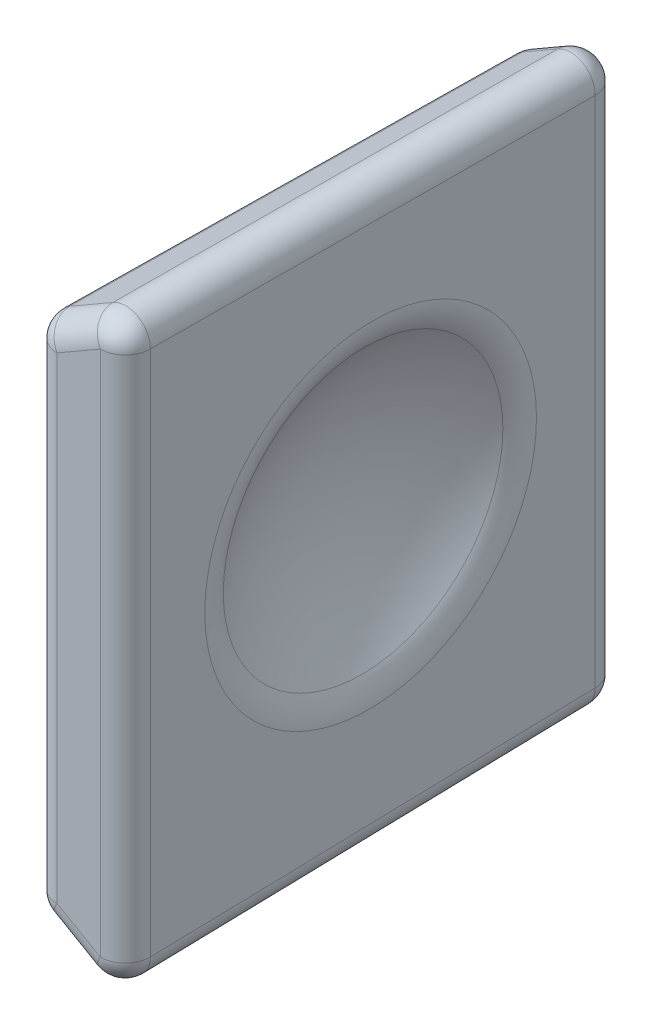
ISO-10303-21;
HEADER;
FILE_DESCRIPTION(('STEP AP214'),'2;1');
FILE_NAME('part.step','',(''),(''),'','','');
FILE_SCHEMA(('AUTOMOTIVE_DESIGN { 1 0 10303 214 1 1 1 1 }'));
ENDSEC;
DATA;
#1=APPLICATION_CONTEXT('core data for automotive mechanical design processes');
#2=APPLICATION_PROTOCOL_DEFINITION('international standard','automotive_design',2000,#1);
#3=PRODUCT_CONTEXT('',#1,'mechanical');
#4=PRODUCT('Part','Part','',(#3));
#5=PRODUCT_RELATED_PRODUCT_CATEGORY('part','',(#4));
#6=PRODUCT_DEFINITION_FORMATION('','',#4);
#7=PRODUCT_DEFINITION_CONTEXT('part definition',#1,'design');
#8=PRODUCT_DEFINITION('design','',#6,#7);
#9=PRODUCT_DEFINITION_SHAPE('','',#8);
#10=(LENGTH_UNIT() NAMED_UNIT(*) SI_UNIT(.MILLI.,.METRE.));
#11=(NAMED_UNIT(*) PLANE_ANGLE_UNIT() SI_UNIT($,.RADIAN.));
#12=(NAMED_UNIT(*) SI_UNIT($,.STERADIAN.) SOLID_ANGLE_UNIT());
#13=UNCERTAINTY_MEASURE_WITH_UNIT(LENGTH_MEASURE(1.E-05),#10,'distance_accuracy_value','');
#14=(GEOMETRIC_REPRESENTATION_CONTEXT(3) GLOBAL_UNCERTAINTY_ASSIGNED_CONTEXT((#13)) GLOBAL_UNIT_ASSIGNED_CONTEXT((#10,
#11,#12)) REPRESENTATION_CONTEXT('',''));
#15=CARTESIAN_POINT('',(0.,0.,0.));
#16=DIRECTION('',(0.,0.,1.));
#17=DIRECTION('',(1.,0.,0.));
#18=AXIS2_PLACEMENT_3D('',#15,#16,#17);
#19=CARTESIAN_POINT('',(0.,0.,0.));
#20=DIRECTION('',(0.999961923064171,0.,-0.00872653549837395));
#21=DIRECTION('',(-0.00872653549837395,0.,-0.999961923064171));
#22=AXIS2_PLACEMENT_3D('',#19,#20,#21);
#23=PLANE('',#22);
#24=CARTESIAN_POINT('',(-0.0866037831003834,0.,-9.92381060156461));
#25=DIRECTION('',(0.999961923064171,0.,-0.00872653549837395));
#26=DIRECTION('',(-0.00872653549837395,0.,-0.999961923064171));
#27=AXIS2_PLACEMENT_3D('',#24,#25,#26);
#28=CIRCLE('',#27,6.71078287266393);
#29=CARTESIAN_POINT('',(-0.145165668060565,0.,-16.6343379481797));
#30=VERTEX_POINT('',#29);
#31=EDGE_CURVE('E11',#30,#30,#28,.F.);
#32=ORIENTED_EDGE('',*,*,#31,.T.);
#33=EDGE_LOOP('',(#32));
#34=FACE_BOUND('',#33,.T.);
#35=DIRECTION('',(-0.00872553884892132,0.0151130766097479,-0.999847718348741));
#36=VECTOR('',#35,1.);
#37=CARTESIAN_POINT('',(-0.00143290861011972,-10.8636094844566,-0.164195063392613));
#38=LINE('',#37,#36);
#39=CARTESIAN_POINT('',(-0.00880302311232161,-10.8508440716812,-1.00872653549837));
#40=VERTEX_POINT('',#39);
#41=CARTESIAN_POINT('',(-0.16588664334598,-10.5787672603996,-19.0087265354984));
#42=VERTEX_POINT('',#41);
#43=EDGE_CURVE('E179',#40,#42,#38,.T.);
#44=ORIENTED_EDGE('',*,*,#43,.T.);
#45=DIRECTION('',(0.,-1.,0.));
#46=VECTOR('',#45,1.);
#47=CARTESIAN_POINT('',(-0.165886643345981,0.,-19.0087265354984));
#48=LINE('',#47,#46);
#49=CARTESIAN_POINT('',(-0.165886643345983,10.00141699121,-19.0087265354984));
#50=VERTEX_POINT('',#49);
#51=EDGE_CURVE('E184',#42,#50,#48,.F.);
#52=ORIENTED_EDGE('',*,*,#51,.T.);
#53=DIRECTION('',(-0.00872553884892131,-0.0151130766097478,-0.999847718348741));
#54=VECTOR('',#53,1.);
#55=CARTESIAN_POINT('',(-0.00135677358191827,10.286391085004,-0.155470853283155));
#56=LINE('',#55,#54);
#57=CARTESIAN_POINT('',(-0.0088030231123242,10.2734938024915,-1.00872653549837));
#58=VERTEX_POINT('',#57);
#59=EDGE_CURVE('E181',#50,#58,#56,.F.);
#60=ORIENTED_EDGE('',*,*,#59,.T.);
#61=DIRECTION('',(0.,-1.,0.));
#62=VECTOR('',#61,1.);
#63=CARTESIAN_POINT('',(-0.00880302311232139,-12.5980762113533,-1.00872653549837));
#64=LINE('',#63,#62);
#65=EDGE_CURVE('E177',#58,#40,#64,.T.);
#66=ORIENTED_EDGE('',*,*,#65,.T.);
#67=EDGE_LOOP('',(#44,#52,#60,#66));
#68=FACE_BOUND('',#67,.T.);
#69=ADVANCED_FACE('F32',(#34,#68),#23,.T.);
#70=CARTESIAN_POINT('',(-5.45512701892224,-9.44855715851495,0.));
#71=DIRECTION('',(-0.49998096153209,-0.86599242819071,-0.00872653549837395));
#72=DIRECTION('',(0.866025403784436,-0.500000000000005,0.));
#73=AXIS2_PLACEMENT_3D('',#70,#71,#72);
#74=PLANE('',#73);
#75=DIRECTION('',(-0.0087264247426805,-0.00503820367424957,0.999949231718764));
#76=VECTOR('',#75,1.);
#77=CARTESIAN_POINT('',(-3.07562129381519,-10.6208563599375,-19.9970914501805));
#78=LINE('',#77,#76);
#79=CARTESIAN_POINT('',(-3.2413302439883,-10.716528466927,-1.00872653549837));
#80=VERTEX_POINT('',#79);
#81=CARTESIAN_POINT('',(-3.08424662375464,-10.6258361964999,-19.0087265354984));
#82=VERTEX_POINT('',#81);
#83=EDGE_CURVE('E128',#80,#82,#78,.F.);
#84=ORIENTED_EDGE('',*,*,#83,.T.);
#85=DIRECTION('',(-0.866025403784436,0.500000000000005,0.));
#86=VECTOR('',#85,1.);
#87=CARTESIAN_POINT('',(-5.37218369724925,-9.3048951112288,-19.0087265354984));
#88=LINE('',#87,#86);
#89=CARTESIAN_POINT('',(-1.66582952794224,-11.4447596885903,-19.0087265354984));
#90=VERTEX_POINT('',#89);
#91=EDGE_CURVE('E166',#82,#90,#88,.F.);
#92=ORIENTED_EDGE('',*,*,#91,.T.);
#93=DIRECTION('',(-0.00872553884892132,0.0151130766097479,-0.999847718348741));
#94=VECTOR('',#93,1.);
#95=CARTESIAN_POINT('',(-1.5005451407075,-11.7310406449788,-0.0690117148189042));
#96=LINE('',#95,#94);
#97=CARTESIAN_POINT('',(-1.50874590770858,-11.7168364998719,-1.00872653549837));
#98=VERTEX_POINT('',#97);
#99=EDGE_CURVE('E163',#90,#98,#96,.F.);
#100=ORIENTED_EDGE('',*,*,#99,.T.);
#101=DIRECTION('',(-0.866025403784436,0.500000000000005,0.));
#102=VECTOR('',#101,1.);
#103=CARTESIAN_POINT('',(-3.74571271707654,-10.425323110315,-1.00872653549837));
#104=LINE('',#103,#102);
#105=EDGE_CURVE('E158',#98,#80,#104,.T.);
#106=ORIENTED_EDGE('',*,*,#105,.T.);
#107=EDGE_LOOP('',(#84,#92,#100,#106));
#108=FACE_BOUND('',#107,.T.);
#109=ADVANCED_FACE('F268',(#108),#74,.T.);
#110=CARTESIAN_POINT('',(-3.7501142286327,0.,0.));
#111=DIRECTION('',(-0.999961923064171,0.,-0.00872653549837395));
#112=DIRECTION('',(-0.00872653549837395,0.,0.999961923064171));
#113=AXIS2_PLACEMENT_3D('',#110,#111,#112);
#114=PLANE('',#113);
#115=DIRECTION('',(0.0087264247426805,-0.0050382036742496,-0.999949231718764));
#116=VECTOR('',#115,1.);
#117=CARTESIAN_POINT('',(-3.57560225534727,9.17751366255712,-19.9970914501805));
#118=LINE('',#117,#116);
#119=CARTESIAN_POINT('',(-3.74131120552038,9.2731857695467,-1.00872653549837));
#120=VERTEX_POINT('',#119);
#121=CARTESIAN_POINT('',(-3.58422758528672,9.18249349911952,-19.0087265354984));
#122=VERTEX_POINT('',#121);
#123=EDGE_CURVE('E150',#120,#122,#118,.T.);
#124=ORIENTED_EDGE('',*,*,#123,.T.);
#125=DIRECTION('',(0.,-1.,0.));
#126=VECTOR('',#125,1.);
#127=CARTESIAN_POINT('',(-3.58422758528672,-10.3321775625968,-19.0087265354984));
#128=LINE('',#127,#126);
#129=CARTESIAN_POINT('',(-3.58422758528672,-9.75984376830915,-19.0087265354984));
#130=VERTEX_POINT('',#129);
#131=EDGE_CURVE('E155',#122,#130,#128,.T.);
#132=ORIENTED_EDGE('',*,*,#131,.T.);
#133=DIRECTION('',(0.0087264247426805,0.00503820367424957,-0.999949231718764));
#134=VECTOR('',#133,1.);
#135=CARTESIAN_POINT('',(-3.75013961116244,-9.85563312111029,0.002908549819483));
#136=LINE('',#135,#134);
#137=CARTESIAN_POINT('',(-3.74131120552038,-9.85053603873633,-1.00872653549837));
#138=VERTEX_POINT('',#137);
#139=EDGE_CURVE('E126',#130,#138,#136,.F.);
#140=ORIENTED_EDGE('',*,*,#139,.T.);
#141=DIRECTION('',(0.,-1.,0.));
#142=VECTOR('',#141,1.);
#143=CARTESIAN_POINT('',(-3.74131120552038,0.,-1.00872653549837));
#144=LINE('',#143,#142);
#145=EDGE_CURVE('E144',#138,#120,#144,.F.);
#146=ORIENTED_EDGE('',*,*,#145,.T.);
#147=EDGE_LOOP('',(#124,#132,#140,#146));
#148=FACE_BOUND('',#147,.T.);
#149=ADVANCED_FACE('F153',(#148),#114,.T.);
#150=CARTESIAN_POINT('',(-5.2051270189222,9.01554445662277,0.));
#151=DIRECTION('',(-0.499980961532086,0.865992428190713,-0.00872653549837395));
#152=DIRECTION('',(-0.866025403784439,-0.5,0.));
#153=AXIS2_PLACEMENT_3D('',#150,#151,#152);
#154=PLANE('',#153);
#155=DIRECTION('',(-0.00872553884892131,-0.0151130766097478,-0.999847718348741));
#156=VECTOR('',#155,1.);
#157=CARTESIAN_POINT('',(-1.50050707319339,11.1537563106577,-0.0646496097641742));
#158=LINE('',#157,#156);
#159=CARTESIAN_POINT('',(-1.50874590770858,11.1394862306822,-1.00872653549837));
#160=VERTEX_POINT('',#159);
#161=CARTESIAN_POINT('',(-1.66582952794224,10.8674094194007,-19.0087265354984));
#162=VERTEX_POINT('',#161);
#163=EDGE_CURVE('E170',#160,#162,#158,.T.);
#164=ORIENTED_EDGE('',*,*,#163,.T.);
#165=DIRECTION('',(0.866025403784439,0.5,0.));
#166=VECTOR('',#165,1.);
#167=CARTESIAN_POINT('',(-5.12218369724921,8.87188240933662,-19.0087265354984));
#168=LINE('',#167,#166);
#169=CARTESIAN_POINT('',(-3.08424662375464,10.0484859273102,-19.0087265354984));
#170=VERTEX_POINT('',#169);
#171=EDGE_CURVE('E175',#162,#170,#168,.F.);
#172=ORIENTED_EDGE('',*,*,#171,.T.);
#173=DIRECTION('',(-0.0087264247426805,0.0050382036742496,0.999949231718764));
#174=VECTOR('',#173,1.);
#175=CARTESIAN_POINT('',(-3.25015864963036,10.1442752801114,0.00290854981948303));
#176=LINE('',#175,#174);
#177=CARTESIAN_POINT('',(-3.24133024398829,10.1391781977374,-1.00872653549837));
#178=VERTEX_POINT('',#177);
#179=EDGE_CURVE('E172',#170,#178,#176,.T.);
#180=ORIENTED_EDGE('',*,*,#179,.T.);
#181=DIRECTION('',(0.866025403784439,0.5,0.));
#182=VECTOR('',#181,1.);
#183=CARTESIAN_POINT('',(0.00440151155616215,12.0131023005183,-1.00872653549837));
#184=LINE('',#183,#182);
#185=EDGE_CURVE('E168',#178,#160,#184,.T.);
#186=ORIENTED_EDGE('',*,*,#185,.T.);
#187=EDGE_LOOP('',(#164,#172,#180,#186));
#188=FACE_BOUND('',#187,.T.);
#189=ADVANCED_FACE('F279',(#188),#154,.T.);
#190=CARTESIAN_POINT('',(0.,0.,-20.));
#191=DIRECTION('',(0.,0.,1.));
#192=DIRECTION('',(1.,0.,0.));
#193=AXIS2_PLACEMENT_3D('',#190,#191,#192);
#194=PLANE('',#193);
#195=DIRECTION('',(0.866025403784436,-0.500000000000005,0.));
#196=VECTOR('',#195,1.);
#197=CARTESIAN_POINT('',(-4.87220273571716,-8.43890268303809,-20.));
#198=LINE('',#197,#196);
#199=CARTESIAN_POINT('',(-1.16584856641015,-10.5787672603996,-20.));
#200=VERTEX_POINT('',#199);
#201=CARTESIAN_POINT('',(-2.58426566222255,-9.75984376830914,-20.));
#202=VERTEX_POINT('',#201);
#203=EDGE_CURVE('E186',#200,#202,#198,.F.);
#204=ORIENTED_EDGE('',*,*,#203,.T.);
#205=DIRECTION('',(0.,-1.,0.));
#206=VECTOR('',#205,1.);
#207=CARTESIAN_POINT('',(-2.58426566222255,9.75482729340722,-20.));
#208=LINE('',#207,#206);
#209=CARTESIAN_POINT('',(-2.58426566222255,9.18249349911952,-20.));
#210=VERTEX_POINT('',#209);
#211=EDGE_CURVE('E192',#202,#210,#208,.F.);
#212=ORIENTED_EDGE('',*,*,#211,.T.);
#213=DIRECTION('',(-0.866025403784439,-0.5,0.));
#214=VECTOR('',#213,1.);
#215=CARTESIAN_POINT('',(-4.62220273571712,8.00588998114591,-20.));
#216=LINE('',#215,#214);
#217=CARTESIAN_POINT('',(-1.16584856641015,10.00141699121,-20.));
#218=VERTEX_POINT('',#217);
#219=EDGE_CURVE('E190',#210,#218,#216,.F.);
#220=ORIENTED_EDGE('',*,*,#219,.T.);
#221=DIRECTION('',(0.,1.,0.));
#222=VECTOR('',#221,1.);
#223=CARTESIAN_POINT('',(-1.16584856641015,0.,-20.));
#224=LINE('',#223,#222);
#225=EDGE_CURVE('E188',#218,#200,#224,.F.);
#226=ORIENTED_EDGE('',*,*,#225,.T.);
#227=EDGE_LOOP('',(#204,#212,#220,#226));
#228=FACE_BOUND('',#227,.T.);
#229=ADVANCED_FACE('F282',(#228),#194,.F.);
#230=CARTESIAN_POINT('',(0.,0.,0.));
#231=DIRECTION('',(0.,0.,1.));
#232=DIRECTION('',(1.,0.,0.));
#233=AXIS2_PLACEMENT_3D('',#230,#231,#232);
#234=PLANE('',#233);
#235=DIRECTION('',(-0.866025403784439,-0.5,0.));
#236=VECTOR('',#235,1.);
#237=CARTESIAN_POINT('',(-3.24573175554446,8.98198041293467,0.));
#238=LINE('',#237,#236);
#239=CARTESIAN_POINT('',(-1.0087649461765,10.2734938024915,0.));
#240=VERTEX_POINT('',#239);
#241=CARTESIAN_POINT('',(-2.74134928245621,9.2731857695467,0.));
#242=VERTEX_POINT('',#241);
#243=EDGE_CURVE('E47',#240,#242,#238,.T.);
#244=ORIENTED_EDGE('',*,*,#243,.T.);
#245=DIRECTION('',(0.,-1.,0.));
#246=VECTOR('',#245,1.);
#247=CARTESIAN_POINT('',(-2.74134928245621,0.,0.));
#248=LINE('',#247,#246);
#249=CARTESIAN_POINT('',(-2.74134928245621,-9.85053603873633,0.));
#250=VERTEX_POINT('',#249);
#251=EDGE_CURVE('E199',#242,#250,#248,.T.);
#252=ORIENTED_EDGE('',*,*,#251,.T.);
#253=DIRECTION('',(0.866025403784436,-0.500000000000005,0.));
#254=VECTOR('',#253,1.);
#255=CARTESIAN_POINT('',(0.504382473088255,-11.7244601415173,0.));
#256=LINE('',#255,#254);
#257=CARTESIAN_POINT('',(-1.00876494617649,-10.8508440716812,0.));
#258=VERTEX_POINT('',#257);
#259=EDGE_CURVE('E195',#250,#258,#256,.T.);
#260=ORIENTED_EDGE('',*,*,#259,.T.);
#261=DIRECTION('',(0.,1.,0.));
#262=VECTOR('',#261,1.);
#263=CARTESIAN_POINT('',(-1.0087649461765,12.0207259421637,0.));
#264=LINE('',#263,#262);
#265=EDGE_CURVE('E52',#258,#240,#264,.T.);
#266=ORIENTED_EDGE('',*,*,#265,.T.);
#267=EDGE_LOOP('',(#244,#252,#260,#266));
#268=FACE_BOUND('',#267,.T.);
#269=ADVANCED_FACE('F357',(#268),#234,.T.);
#270=CARTESIAN_POINT('',(-1.00131869664609,10.286391085004,-0.146744317784781));
#271=DIRECTION('',(0.00872553884892131,0.0151130766097478,0.999847718348741));
#272=DIRECTION('',(0.,-0.99988578223937,0.0151136519598582));
#273=AXIS2_PLACEMENT_3D('',#270,#271,#272);
#274=CYLINDRICAL_SURFACE('',#273,1.);
#275=CARTESIAN_POINT('',(-1.16584856641015,10.00141699121,-19.));
#276=DIRECTION('',(-0.00872553884892273,-0.0151130766097502,-0.999847718348741));
#277=DIRECTION('',(0.,0.99988578223937,-0.0151136519598606));
#278=AXIS2_PLACEMENT_3D('',#275,#276,#277);
#279=CIRCLE('',#278,1.);
#280=EDGE_CURVE('E151',#162,#50,#279,.T.);
#281=ORIENTED_EDGE('',*,*,#280,.F.);
#282=ORIENTED_EDGE('',*,*,#163,.F.);
#283=CARTESIAN_POINT('',(-1.0087649461765,10.2734938024915,-1.));
#284=DIRECTION('',(0.00872553884892122,0.0151130766097476,0.999847718348741));
#285=DIRECTION('',(0.,-0.99988578223937,0.015113651959858));
#286=AXIS2_PLACEMENT_3D('',#283,#284,#285);
#287=CIRCLE('',#286,1.);
#288=EDGE_CURVE('E251',#58,#160,#287,.T.);
#289=ORIENTED_EDGE('',*,*,#288,.F.);
#290=ORIENTED_EDGE('',*,*,#59,.F.);
#291=EDGE_LOOP('',(#281,#282,#289,#290));
#292=FACE_BOUND('',#291,.T.);
#293=ADVANCED_FACE('F354',(#292),#274,.T.);
#294=CARTESIAN_POINT('',(-1.16584856641015,10.00141699121,-19.));
#295=DIRECTION('',(0.,0.,1.));
#296=DIRECTION('',(1.,0.,0.));
#297=AXIS2_PLACEMENT_3D('',#294,#295,#296);
#298=SPHERICAL_SURFACE('',#297,1.);
#299=CARTESIAN_POINT('',(-1.16584856641015,10.00141699121,-19.));
#300=DIRECTION('',(0.866025403784438,0.500000000000001,0.));
#301=DIRECTION('',(-0.500000000000001,0.866025403784438,0.));
#302=AXIS2_PLACEMENT_3D('',#299,#300,#301);
#303=CIRCLE('',#302,1.);
#304=EDGE_CURVE('E245',#162,#218,#303,.F.);
#305=ORIENTED_EDGE('',*,*,#304,.F.);
#306=ORIENTED_EDGE('',*,*,#280,.T.);
#307=CARTESIAN_POINT('',(-1.16584856641015,10.00141699121,-19.));
#308=DIRECTION('',(0.,1.,0.));
#309=DIRECTION('',(0.,0.,1.));
#310=AXIS2_PLACEMENT_3D('',#307,#308,#309);
#311=CIRCLE('',#310,1.);
#312=EDGE_CURVE('E248',#218,#50,#311,.F.);
#313=ORIENTED_EDGE('',*,*,#312,.F.);
#314=EDGE_LOOP('',(#305,#306,#313));
#315=FACE_BOUND('',#314,.T.);
#316=ADVANCED_FACE('F351',(#315),#298,.T.);
#317=CARTESIAN_POINT('',(-1.0087649461765,10.2734938024915,-1.));
#318=DIRECTION('',(0.,0.,1.));
#319=DIRECTION('',(1.,0.,0.));
#320=AXIS2_PLACEMENT_3D('',#317,#318,#319);
#321=SPHERICAL_SURFACE('',#320,1.);
#322=CARTESIAN_POINT('',(-1.0087649461765,10.2734938024915,-1.));
#323=DIRECTION('',(0.,1.,0.));
#324=DIRECTION('',(0.,0.,1.));
#325=AXIS2_PLACEMENT_3D('',#322,#323,#324);
#326=CIRCLE('',#325,1.);
#327=EDGE_CURVE('E240',#58,#240,#326,.F.);
#328=ORIENTED_EDGE('',*,*,#327,.F.);
#329=ORIENTED_EDGE('',*,*,#288,.T.);
#330=CARTESIAN_POINT('',(-1.0087649461765,10.2734938024915,-1.));
#331=DIRECTION('',(0.866025403784439,0.5,0.));
#332=DIRECTION('',(-0.5,0.866025403784439,0.));
#333=AXIS2_PLACEMENT_3D('',#330,#331,#332);
#334=CIRCLE('',#333,1.);
#335=EDGE_CURVE('E242',#240,#160,#334,.F.);
#336=ORIENTED_EDGE('',*,*,#335,.F.);
#337=EDGE_LOOP('',(#328,#329,#336));
#338=FACE_BOUND('',#337,.T.);
#339=ADVANCED_FACE('F347',(#338),#321,.T.);
#340=CARTESIAN_POINT('',(-1.16584856641015,0.,-19.));
#341=DIRECTION('',(0.,1.,0.));
#342=DIRECTION('',(-1.,0.,0.));
#343=AXIS2_PLACEMENT_3D('',#340,#341,#342);
#344=CYLINDRICAL_SURFACE('',#343,1.);
#345=ORIENTED_EDGE('',*,*,#312,.T.);
#346=ORIENTED_EDGE('',*,*,#51,.F.);
#347=CARTESIAN_POINT('',(-1.16584856641015,-10.5787672603996,-19.));
#348=DIRECTION('',(0.,-1.,0.));
#349=DIRECTION('',(1.,0.,0.));
#350=AXIS2_PLACEMENT_3D('',#347,#348,#349);
#351=CIRCLE('',#350,1.);
#352=EDGE_CURVE('E234',#200,#42,#351,.T.);
#353=ORIENTED_EDGE('',*,*,#352,.F.);
#354=ORIENTED_EDGE('',*,*,#225,.F.);
#355=EDGE_LOOP('',(#345,#346,#353,#354));
#356=FACE_BOUND('',#355,.T.);
#357=ADVANCED_FACE('F343',(#356),#344,.T.);
#358=CARTESIAN_POINT('',(-4.62220273571712,8.00588998114591,-19.));
#359=DIRECTION('',(-0.866025403784439,-0.5,0.));
#360=DIRECTION('',(0.5,-0.866025403784439,0.));
#361=AXIS2_PLACEMENT_3D('',#358,#359,#360);
#362=CYLINDRICAL_SURFACE('',#361,1.);
#363=ORIENTED_EDGE('',*,*,#304,.T.);
#364=ORIENTED_EDGE('',*,*,#219,.F.);
#365=CARTESIAN_POINT('',(-2.58426566222255,9.18249349911952,-19.));
#366=DIRECTION('',(-0.866025403784439,-0.5,0.));
#367=DIRECTION('',(0.5,-0.866025403784439,0.));
#368=AXIS2_PLACEMENT_3D('',#365,#366,#367);
#369=CIRCLE('',#368,1.);
#370=EDGE_CURVE('E231',#170,#210,#369,.T.);
#371=ORIENTED_EDGE('',*,*,#370,.F.);
#372=ORIENTED_EDGE('',*,*,#171,.F.);
#373=EDGE_LOOP('',(#363,#364,#371,#372));
#374=FACE_BOUND('',#373,.T.);
#375=ADVANCED_FACE('F339',(#374),#362,.T.);
#376=CARTESIAN_POINT('',(-2.75025155472172,9.2783254988356,0.0200993619886606));
#377=DIRECTION('',(-0.0087264247426805,0.0050382036742496,0.999949231718764));
#378=DIRECTION('',(0.999961923064171,0.,0.00872653549837395));
#379=AXIS2_PLACEMENT_3D('',#376,#377,#378);
#380=CYLINDRICAL_SURFACE('',#379,1.);
#381=CARTESIAN_POINT('',(-2.74134928245621,9.2731857695467,-1.));
#382=DIRECTION('',(-0.00872642474268041,0.00503820367424954,0.999949231718764));
#383=DIRECTION('',(0.999961923064171,0.,0.00872653549837386));
#384=AXIS2_PLACEMENT_3D('',#381,#382,#383);
#385=CIRCLE('',#384,1.);
#386=EDGE_CURVE('E225',#178,#120,#385,.T.);
#387=ORIENTED_EDGE('',*,*,#386,.F.);
#388=ORIENTED_EDGE('',*,*,#179,.F.);
#389=CARTESIAN_POINT('',(-2.58426566222255,9.18249349911952,-19.));
#390=DIRECTION('',(0.00872642474268192,-0.00503820367425041,-0.999949231718764));
#391=DIRECTION('',(-0.999961923064171,0.,-0.00872653549837538));
#392=AXIS2_PLACEMENT_3D('',#389,#390,#391);
#393=CIRCLE('',#392,1.);
#394=EDGE_CURVE('E228',#122,#170,#393,.T.);
#395=ORIENTED_EDGE('',*,*,#394,.F.);
#396=ORIENTED_EDGE('',*,*,#123,.F.);
#397=EDGE_LOOP('',(#387,#388,#395,#396));
#398=FACE_BOUND('',#397,.T.);
#399=ADVANCED_FACE('F335',(#398),#380,.T.);
#400=CARTESIAN_POINT('',(-4.70074454583395,8.14192838678669,-1.));
#401=DIRECTION('',(0.866025403784439,0.5,0.));
#402=DIRECTION('',(-0.5,0.866025403784439,0.));
#403=AXIS2_PLACEMENT_3D('',#400,#401,#402);
#404=CYLINDRICAL_SURFACE('',#403,1.);
#405=ORIENTED_EDGE('',*,*,#335,.T.);
#406=ORIENTED_EDGE('',*,*,#185,.F.);
#407=CARTESIAN_POINT('',(-2.74134928245621,9.2731857695467,-1.));
#408=DIRECTION('',(-0.866025403784439,-0.5,0.));
#409=DIRECTION('',(0.5,-0.866025403784439,0.));
#410=AXIS2_PLACEMENT_3D('',#407,#408,#409);
#411=CIRCLE('',#410,1.);
#412=EDGE_CURVE('E223',#242,#178,#411,.T.);
#413=ORIENTED_EDGE('',*,*,#412,.F.);
#414=ORIENTED_EDGE('',*,*,#243,.F.);
#415=EDGE_LOOP('',(#405,#406,#413,#414));
#416=FACE_BOUND('',#415,.T.);
#417=ADVANCED_FACE('F331',(#416),#404,.T.);
#418=CARTESIAN_POINT('',(-1.00876494617649,0.,-1.));
#419=DIRECTION('',(0.,-1.,0.));
#420=DIRECTION('',(1.,0.,0.));
#421=AXIS2_PLACEMENT_3D('',#418,#419,#420);
#422=CYLINDRICAL_SURFACE('',#421,1.);
#423=ORIENTED_EDGE('',*,*,#327,.T.);
#424=ORIENTED_EDGE('',*,*,#265,.F.);
#425=CARTESIAN_POINT('',(-1.00876494617649,-10.8508440716812,-1.));
#426=DIRECTION('',(0.,-1.,0.));
#427=DIRECTION('',(0.,0.,-1.));
#428=AXIS2_PLACEMENT_3D('',#425,#426,#427);
#429=CIRCLE('',#428,1.);
#430=EDGE_CURVE('E220',#40,#258,#429,.T.);
#431=ORIENTED_EDGE('',*,*,#430,.F.);
#432=ORIENTED_EDGE('',*,*,#65,.F.);
#433=EDGE_LOOP('',(#423,#424,#431,#432));
#434=FACE_BOUND('',#433,.T.);
#435=ADVANCED_FACE('F327',(#434),#422,.T.);
#436=CARTESIAN_POINT('',(-1.00056417917541,-10.8650482167881,-0.0602851793205302));
#437=DIRECTION('',(0.00872553884892132,-0.0151130766097479,0.999847718348741));
#438=DIRECTION('',(0.,-0.99988578223937,-0.0151136519598583));
#439=AXIS2_PLACEMENT_3D('',#436,#437,#438);
#440=CYLINDRICAL_SURFACE('',#439,1.);
#441=CARTESIAN_POINT('',(-1.16584856641015,-10.5787672603996,-19.));
#442=DIRECTION('',(-0.00872553884892274,0.0151130766097503,-0.999847718348741));
#443=DIRECTION('',(0.,0.99988578223937,0.0151136519598607));
#444=AXIS2_PLACEMENT_3D('',#441,#442,#443);
#445=CIRCLE('',#444,1.);
#446=EDGE_CURVE('E237',#42,#90,#445,.T.);
#447=ORIENTED_EDGE('',*,*,#446,.F.);
#448=ORIENTED_EDGE('',*,*,#43,.F.);
#449=CARTESIAN_POINT('',(-1.00876494617649,-10.8508440716812,-1.));
#450=DIRECTION('',(0.00872553884892122,-0.0151130766097477,0.999847718348741));
#451=DIRECTION('',(0.,-0.99988578223937,-0.0151136519598581));
#452=AXIS2_PLACEMENT_3D('',#449,#450,#451);
#453=CIRCLE('',#452,1.);
#454=EDGE_CURVE('E217',#98,#40,#453,.T.);
#455=ORIENTED_EDGE('',*,*,#454,.F.);
#456=ORIENTED_EDGE('',*,*,#99,.F.);
#457=EDGE_LOOP('',(#447,#448,#455,#456));
#458=FACE_BOUND('',#457,.T.);
#459=ADVANCED_FACE('F323',(#458),#440,.T.);
#460=CARTESIAN_POINT('',(-1.16584856641015,-10.5787672603996,-19.));
#461=DIRECTION('',(0.,0.,1.));
#462=DIRECTION('',(1.,0.,0.));
#463=AXIS2_PLACEMENT_3D('',#460,#461,#462);
#464=SPHERICAL_SURFACE('',#463,1.);
#465=ORIENTED_EDGE('',*,*,#352,.T.);
#466=ORIENTED_EDGE('',*,*,#446,.T.);
#467=CARTESIAN_POINT('',(-1.16584856641015,-10.5787672603996,-19.));
#468=DIRECTION('',(0.866025403784436,-0.500000000000005,0.));
#469=DIRECTION('',(0.500000000000005,0.866025403784436,0.));
#470=AXIS2_PLACEMENT_3D('',#467,#468,#469);
#471=CIRCLE('',#470,1.);
#472=EDGE_CURVE('E214',#200,#90,#471,.F.);
#473=ORIENTED_EDGE('',*,*,#472,.F.);
#474=EDGE_LOOP('',(#465,#466,#473));
#475=FACE_BOUND('',#474,.T.);
#476=ADVANCED_FACE('F319',(#475),#464,.T.);
#477=CARTESIAN_POINT('',(-2.58426566222255,9.18249349911952,-19.));
#478=DIRECTION('',(0.,0.,1.));
#479=DIRECTION('',(1.,0.,0.));
#480=AXIS2_PLACEMENT_3D('',#477,#478,#479);
#481=SPHERICAL_SURFACE('',#480,1.);
#482=ORIENTED_EDGE('',*,*,#394,.T.);
#483=ORIENTED_EDGE('',*,*,#370,.T.);
#484=CARTESIAN_POINT('',(-2.58426566222255,9.18249349911952,-19.));
#485=DIRECTION('',(0.,1.,0.));
#486=DIRECTION('',(-1.,0.,0.));
#487=AXIS2_PLACEMENT_3D('',#484,#485,#486);
#488=CIRCLE('',#487,1.);
#489=EDGE_CURVE('E212',#122,#210,#488,.F.);
#490=ORIENTED_EDGE('',*,*,#489,.F.);
#491=EDGE_LOOP('',(#482,#483,#490));
#492=FACE_BOUND('',#491,.T.);
#493=ADVANCED_FACE('F315',(#492),#481,.T.);
#494=CARTESIAN_POINT('',(-2.74134928245621,9.2731857695467,-1.));
#495=DIRECTION('',(0.,0.,1.));
#496=DIRECTION('',(1.,0.,0.));
#497=AXIS2_PLACEMENT_3D('',#494,#495,#496);
#498=SPHERICAL_SURFACE('',#497,1.);
#499=ORIENTED_EDGE('',*,*,#412,.T.);
#500=ORIENTED_EDGE('',*,*,#386,.T.);
#501=CARTESIAN_POINT('',(-2.74134928245621,9.2731857695467,-1.));
#502=DIRECTION('',(0.,1.,0.));
#503=DIRECTION('',(0.,0.,1.));
#504=AXIS2_PLACEMENT_3D('',#501,#502,#503);
#505=CIRCLE('',#504,1.);
#506=EDGE_CURVE('E147',#242,#120,#505,.F.);
#507=ORIENTED_EDGE('',*,*,#506,.F.);
#508=EDGE_LOOP('',(#499,#500,#507));
#509=FACE_BOUND('',#508,.T.);
#510=ADVANCED_FACE('F311',(#509),#498,.T.);
#511=CARTESIAN_POINT('',(-1.00876494617649,-10.8508440716812,-1.));
#512=DIRECTION('',(0.,0.,1.));
#513=DIRECTION('',(1.,0.,0.));
#514=AXIS2_PLACEMENT_3D('',#511,#512,#513);
#515=SPHERICAL_SURFACE('',#514,1.);
#516=ORIENTED_EDGE('',*,*,#454,.T.);
#517=ORIENTED_EDGE('',*,*,#430,.T.);
#518=CARTESIAN_POINT('',(-1.00876494617649,-10.8508440716812,-1.));
#519=DIRECTION('',(0.866025403784436,-0.500000000000005,0.));
#520=DIRECTION('',(0.500000000000005,0.866025403784436,0.));
#521=AXIS2_PLACEMENT_3D('',#518,#519,#520);
#522=CIRCLE('',#521,1.);
#523=EDGE_CURVE('E208',#98,#258,#522,.F.);
#524=ORIENTED_EDGE('',*,*,#523,.F.);
#525=EDGE_LOOP('',(#516,#517,#524));
#526=FACE_BOUND('',#525,.T.);
#527=ADVANCED_FACE('F307',(#526),#515,.T.);
#528=CARTESIAN_POINT('',(-4.87220273571716,-8.43890268303809,-19.));
#529=DIRECTION('',(0.866025403784436,-0.500000000000005,0.));
#530=DIRECTION('',(0.500000000000005,0.866025403784436,0.));
#531=AXIS2_PLACEMENT_3D('',#528,#529,#530);
#532=CYLINDRICAL_SURFACE('',#531,1.);
#533=ORIENTED_EDGE('',*,*,#472,.T.);
#534=ORIENTED_EDGE('',*,*,#91,.F.);
#535=CARTESIAN_POINT('',(-2.58426566222255,-9.75984376830914,-19.));
#536=DIRECTION('',(-0.866025403784436,0.500000000000005,0.));
#537=DIRECTION('',(-0.500000000000005,-0.866025403784436,0.));
#538=AXIS2_PLACEMENT_3D('',#535,#536,#537);
#539=CIRCLE('',#538,1.);
#540=EDGE_CURVE('E205',#202,#82,#539,.T.);
#541=ORIENTED_EDGE('',*,*,#540,.F.);
#542=ORIENTED_EDGE('',*,*,#203,.F.);
#543=EDGE_LOOP('',(#533,#534,#541,#542));
#544=FACE_BOUND('',#543,.T.);
#545=ADVANCED_FACE('F303',(#544),#532,.T.);
#546=CARTESIAN_POINT('',(-2.58426566222255,0.,-19.));
#547=DIRECTION('',(0.,1.,0.));
#548=DIRECTION('',(0.,0.,1.));
#549=AXIS2_PLACEMENT_3D('',#546,#547,#548);
#550=CYLINDRICAL_SURFACE('',#549,1.);
#551=ORIENTED_EDGE('',*,*,#489,.T.);
#552=ORIENTED_EDGE('',*,*,#211,.F.);
#553=CARTESIAN_POINT('',(-2.58426566222255,-9.75984376830915,-19.));
#554=DIRECTION('',(0.,-1.,0.));
#555=DIRECTION('',(0.,0.,-1.));
#556=AXIS2_PLACEMENT_3D('',#553,#554,#555);
#557=CIRCLE('',#556,1.);
#558=EDGE_CURVE('E141',#130,#202,#557,.T.);
#559=ORIENTED_EDGE('',*,*,#558,.F.);
#560=ORIENTED_EDGE('',*,*,#131,.F.);
#561=EDGE_LOOP('',(#551,#552,#559,#560));
#562=FACE_BOUND('',#561,.T.);
#563=ADVANCED_FACE('F300',(#562),#550,.T.);
#564=CARTESIAN_POINT('',(-2.74134928245621,0.,-1.));
#565=DIRECTION('',(0.,-1.,0.));
#566=DIRECTION('',(0.,0.,-1.));
#567=AXIS2_PLACEMENT_3D('',#564,#565,#566);
#568=CYLINDRICAL_SURFACE('',#567,1.);
#569=ORIENTED_EDGE('',*,*,#506,.T.);
#570=ORIENTED_EDGE('',*,*,#145,.F.);
#571=CARTESIAN_POINT('',(-2.74134928245621,-9.85053603873633,-1.));
#572=DIRECTION('',(0.,-1.,0.));
#573=DIRECTION('',(1.,0.,0.));
#574=AXIS2_PLACEMENT_3D('',#571,#572,#573);
#575=CIRCLE('',#574,1.);
#576=EDGE_CURVE('E133',#250,#138,#575,.T.);
#577=ORIENTED_EDGE('',*,*,#576,.F.);
#578=ORIENTED_EDGE('',*,*,#251,.F.);
#579=EDGE_LOOP('',(#569,#570,#577,#578));
#580=FACE_BOUND('',#579,.T.);
#581=ADVANCED_FACE('F145',(#580),#568,.T.);
#582=CARTESIAN_POINT('',(-4.95074454583399,-8.57494108867887,-1.));
#583=DIRECTION('',(-0.866025403784436,0.500000000000005,0.));
#584=DIRECTION('',(-0.500000000000005,-0.866025403784436,0.));
#585=AXIS2_PLACEMENT_3D('',#582,#583,#584);
#586=CYLINDRICAL_SURFACE('',#585,1.);
#587=ORIENTED_EDGE('',*,*,#523,.T.);
#588=ORIENTED_EDGE('',*,*,#259,.F.);
#589=CARTESIAN_POINT('',(-2.74134928245621,-9.85053603873633,-1.));
#590=DIRECTION('',(-0.866025403784436,0.500000000000005,0.));
#591=DIRECTION('',(-0.500000000000005,-0.866025403784436,0.));
#592=AXIS2_PLACEMENT_3D('',#589,#590,#591);
#593=CIRCLE('',#592,1.);
#594=EDGE_CURVE('E137',#80,#250,#593,.T.);
#595=ORIENTED_EDGE('',*,*,#594,.F.);
#596=ORIENTED_EDGE('',*,*,#105,.F.);
#597=EDGE_LOOP('',(#587,#588,#595,#596));
#598=FACE_BOUND('',#597,.T.);
#599=ADVANCED_FACE('F293',(#598),#586,.T.);
#600=CARTESIAN_POINT('',(-2.58426566222255,-9.75984376830914,-19.));
#601=DIRECTION('',(0.,0.,1.));
#602=DIRECTION('',(1.,0.,0.));
#603=AXIS2_PLACEMENT_3D('',#600,#601,#602);
#604=SPHERICAL_SURFACE('',#603,1.);
#605=ORIENTED_EDGE('',*,*,#558,.T.);
#606=ORIENTED_EDGE('',*,*,#540,.T.);
#607=CARTESIAN_POINT('',(-2.58426566222255,-9.75984376830914,-19.));
#608=DIRECTION('',(0.00872642474268191,0.00503820367425039,-0.999949231718764));
#609=DIRECTION('',(-0.999961923064171,0.,-0.00872653549837536));
#610=AXIS2_PLACEMENT_3D('',#607,#608,#609);
#611=CIRCLE('',#610,1.);
#612=EDGE_CURVE('E130',#130,#82,#611,.F.);
#613=ORIENTED_EDGE('',*,*,#612,.F.);
#614=EDGE_LOOP('',(#605,#606,#613));
#615=FACE_BOUND('',#614,.T.);
#616=ADVANCED_FACE('F290',(#615),#604,.T.);
#617=CARTESIAN_POINT('',(-2.74134928245621,-9.85053603873633,-1.));
#618=DIRECTION('',(0.,0.,1.));
#619=DIRECTION('',(1.,0.,0.));
#620=AXIS2_PLACEMENT_3D('',#617,#618,#619);
#621=SPHERICAL_SURFACE('',#620,1.);
#622=ORIENTED_EDGE('',*,*,#594,.T.);
#623=ORIENTED_EDGE('',*,*,#576,.T.);
#624=CARTESIAN_POINT('',(-2.74134928245621,-9.85053603873633,-1.));
#625=DIRECTION('',(-0.00872642474268041,-0.00503820367424952,0.999949231718764));
#626=DIRECTION('',(0.999961923064171,0.,0.00872653549837386));
#627=AXIS2_PLACEMENT_3D('',#624,#625,#626);
#628=CIRCLE('',#627,1.);
#629=EDGE_CURVE('E122',#80,#138,#628,.F.);
#630=ORIENTED_EDGE('',*,*,#629,.F.);
#631=EDGE_LOOP('',(#622,#623,#630));
#632=FACE_BOUND('',#631,.T.);
#633=ADVANCED_FACE('F135',(#632),#621,.T.);
#634=CARTESIAN_POINT('',(-2.74971899832358,-9.8553682964454,-0.0409255567921817));
#635=DIRECTION('',(-0.0087264247426805,-0.00503820367424957,0.999949231718764));
#636=DIRECTION('',(0.999961923064171,0.,0.00872653549837395));
#637=AXIS2_PLACEMENT_3D('',#634,#635,#636);
#638=CYLINDRICAL_SURFACE('',#637,1.);
#639=ORIENTED_EDGE('',*,*,#612,.T.);
#640=ORIENTED_EDGE('',*,*,#83,.F.);
#641=ORIENTED_EDGE('',*,*,#629,.T.);
#642=ORIENTED_EDGE('',*,*,#139,.F.);
#643=EDGE_LOOP('',(#639,#640,#641,#642));
#644=FACE_BOUND('',#643,.T.);
#645=ADVANCED_FACE('F124',(#644),#638,.T.);
#646=CARTESIAN_POINT('',(8.72683345458359,0.,-10.00072430312));
#647=DIRECTION('',(0.,0.,-1.));
#648=DIRECTION('',(1.,0.,0.));
#649=AXIS2_PLACEMENT_3D('',#646,#647,#648);
#650=SPHERICAL_SURFACE('',#649,10.7268334545836);
#651=CARTESIAN_POINT('',(8.72683345458359,0.,-10.00072430312));
#652=DIRECTION('',(0.999961923064171,0.,-0.00872653549837395));
#653=DIRECTION('',(-0.00872653549837395,0.,-0.999961923064171));
#654=AXIS2_PLACEMENT_3D('',#651,#652,#653);
#655=SPHERICAL_SURFACE('',#654,10.7268334545836);
#656=CARTESIAN_POINT('',(-0.387226523042275,0.,-9.92118710665824));
#657=DIRECTION('',(0.999961923064171,0.,-0.00872653549837395));
#658=DIRECTION('',(-0.00872653549837395,0.,-0.999961923064171));
#659=AXIS2_PLACEMENT_3D('',#656,#657,#658);
#660=CIRCLE('',#659,5.65619488004004);
#661=CARTESIAN_POINT('',(-0.436585508448666,0.,-15.5771666161288));
#662=VERTEX_POINT('',#661);
#663=EDGE_CURVE('E40',#662,#662,#660,.T.);
#664=ORIENTED_EDGE('',*,*,#663,.T.);
#665=EDGE_LOOP('',(#664));
#666=FACE_BOUND('',#665,.T.);
#667=ADVANCED_FACE('F258',(#666),#655,.F.);
#668=CARTESIAN_POINT('',(-2.08652762922873,0.,-9.90635753056786));
#669=DIRECTION('',(0.999961923064171,0.,-0.00872653549837395));
#670=DIRECTION('',(-0.00872653549837395,0.,-0.999961923064171));
#671=AXIS2_PLACEMENT_3D('',#668,#669,#670);
#672=TOROIDAL_SURFACE('',#671,6.71078287266393,2.);
#673=ORIENTED_EDGE('',*,*,#31,.F.);
#674=EDGE_LOOP('',(#673));
#675=FACE_BOUND('',#674,.T.);
#676=ORIENTED_EDGE('',*,*,#663,.F.);
#677=EDGE_LOOP('',(#676));
#678=FACE_BOUND('',#677,.T.);
#679=ADVANCED_FACE('F34',(#675,#678),#672,.T.);
#680=CLOSED_SHELL('',(#69,#109,#149,#189,#229,#269,#293,#316,#339,#357,#375,#399,#417,#435,#459,
#476,#493,#510,#527,#545,#563,#581,#599,#616,#633,#645,#667,#679));
#681=MANIFOLD_SOLID_BREP('B2',#680);
#682=ADVANCED_BREP_SHAPE_REPRESENTATION('',(#18,#681),#14);
#683=SHAPE_DEFINITION_REPRESENTATION(#9,#682);
ENDSEC;
END-ISO-10303-21;
